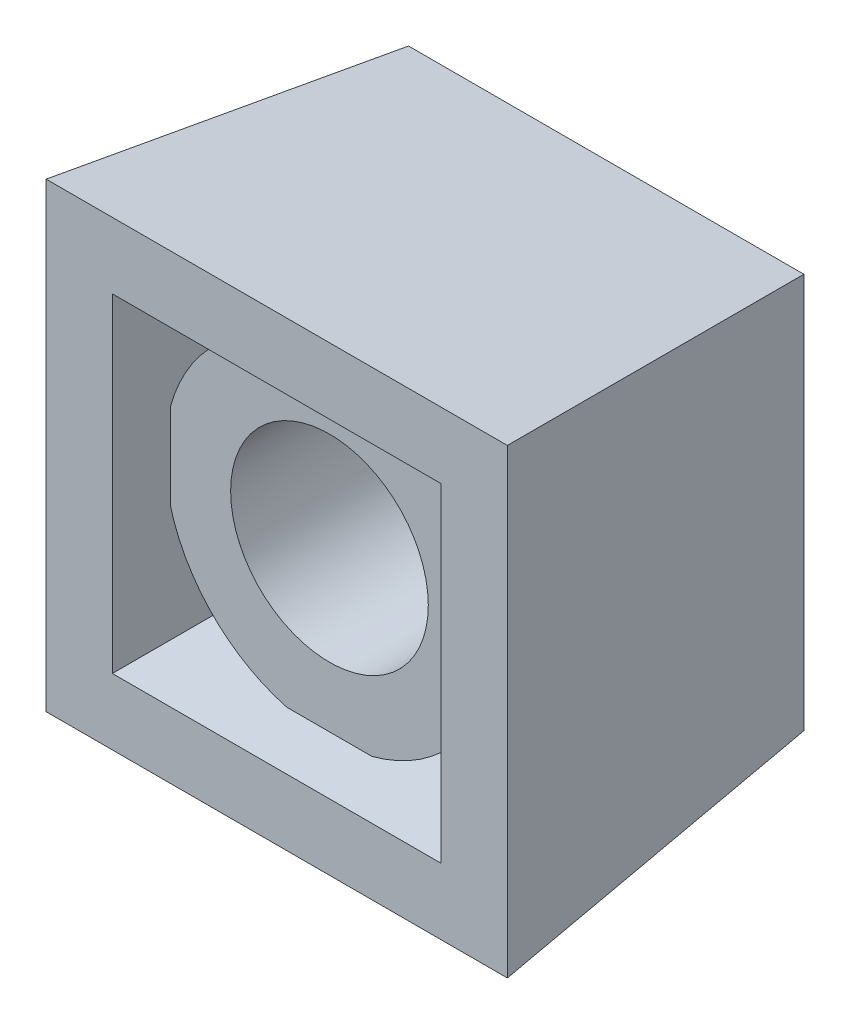
ISO-10303-21;
HEADER;
FILE_DESCRIPTION(('STEP AP214'),'2;1');
FILE_NAME('part.step','',(''),(''),'','','');
FILE_SCHEMA(('AUTOMOTIVE_DESIGN { 1 0 10303 214 1 1 1 1 }'));
ENDSEC;
DATA;
#1=APPLICATION_CONTEXT('core data for automotive mechanical design processes');
#2=APPLICATION_PROTOCOL_DEFINITION('international standard','automotive_design',2000,#1);
#3=PRODUCT_CONTEXT('',#1,'mechanical');
#4=PRODUCT('Part','Part','',(#3));
#5=PRODUCT_RELATED_PRODUCT_CATEGORY('part','',(#4));
#6=PRODUCT_DEFINITION_FORMATION('','',#4);
#7=PRODUCT_DEFINITION_CONTEXT('part definition',#1,'design');
#8=PRODUCT_DEFINITION('design','',#6,#7);
#9=PRODUCT_DEFINITION_SHAPE('','',#8);
#10=(LENGTH_UNIT() NAMED_UNIT(*) SI_UNIT(.MILLI.,.METRE.));
#11=(NAMED_UNIT(*) PLANE_ANGLE_UNIT() SI_UNIT($,.RADIAN.));
#12=(NAMED_UNIT(*) SI_UNIT($,.STERADIAN.) SOLID_ANGLE_UNIT());
#13=UNCERTAINTY_MEASURE_WITH_UNIT(LENGTH_MEASURE(1.E-05),#10,'distance_accuracy_value','');
#14=(GEOMETRIC_REPRESENTATION_CONTEXT(3) GLOBAL_UNCERTAINTY_ASSIGNED_CONTEXT((#13)) GLOBAL_UNIT_ASSIGNED_CONTEXT((#10,
#11,#12)) REPRESENTATION_CONTEXT('',''));
#15=CARTESIAN_POINT('',(0.,0.,0.));
#16=DIRECTION('',(0.,0.,1.));
#17=DIRECTION('',(1.,0.,0.));
#18=AXIS2_PLACEMENT_3D('',#15,#16,#17);
#19=CARTESIAN_POINT('',(0.,0.,1.));
#20=DIRECTION('',(0.,0.,1.));
#21=DIRECTION('',(1.,0.,0.));
#22=AXIS2_PLACEMENT_3D('',#19,#20,#21);
#23=PLANE('',#22);
#24=DIRECTION('',(0.,1.,0.));
#25=VECTOR('',#24,1.);
#26=CARTESIAN_POINT('',(2.09501243788791,0.,1.));
#27=LINE('',#26,#25);
#28=CARTESIAN_POINT('',(2.09501243788791,-2.09501243788791,1.));
#29=VERTEX_POINT('',#28);
#30=CARTESIAN_POINT('',(2.09501243788791,-1.36415647383097,1.));
#31=VERTEX_POINT('',#30);
#32=EDGE_CURVE('E164',#29,#31,#27,.T.);
#33=ORIENTED_EDGE('',*,*,#32,.T.);
#34=CARTESIAN_POINT('',(0.,0.,1.));
#35=DIRECTION('',(0.,0.,1.));
#36=DIRECTION('',(1.,0.,0.));
#37=AXIS2_PLACEMENT_3D('',#34,#35,#36);
#38=CIRCLE('',#37,2.5);
#39=CARTESIAN_POINT('',(1.36415647383097,-2.09501243788791,1.));
#40=VERTEX_POINT('',#39);
#41=EDGE_CURVE('E176',#40,#31,#38,.T.);
#42=ORIENTED_EDGE('',*,*,#41,.F.);
#43=DIRECTION('',(1.,0.,0.));
#44=VECTOR('',#43,1.);
#45=CARTESIAN_POINT('',(0.,-2.09501243788791,1.));
#46=LINE('',#45,#44);
#47=EDGE_CURVE('E230',#40,#29,#46,.T.);
#48=ORIENTED_EDGE('',*,*,#47,.T.);
#49=EDGE_LOOP('',(#33,#42,#48));
#50=FACE_BOUND('',#49,.T.);
#51=ADVANCED_FACE('F41',(#50),#23,.T.);
#52=CARTESIAN_POINT('',(-2.09501243788791,-2.09501243788791,1.));
#53=VERTEX_POINT('',#52);
#54=CARTESIAN_POINT('',(-1.36415647383097,-2.09501243788791,1.));
#55=VERTEX_POINT('',#54);
#56=EDGE_CURVE('E231',#53,#55,#46,.T.);
#57=ORIENTED_EDGE('',*,*,#56,.T.);
#58=CARTESIAN_POINT('',(-2.09501243788791,-1.36415647383097,1.));
#59=VERTEX_POINT('',#58);
#60=EDGE_CURVE('E524',#59,#55,#38,.T.);
#61=ORIENTED_EDGE('',*,*,#60,.F.);
#62=DIRECTION('',(0.,-1.,0.));
#63=VECTOR('',#62,1.);
#64=CARTESIAN_POINT('',(-2.09501243788791,0.,1.));
#65=LINE('',#64,#63);
#66=EDGE_CURVE('E234',#59,#53,#65,.T.);
#67=ORIENTED_EDGE('',*,*,#66,.T.);
#68=EDGE_LOOP('',(#57,#61,#67));
#69=FACE_BOUND('',#68,.T.);
#70=ADVANCED_FACE('F482',(#69),#23,.T.);
#71=CARTESIAN_POINT('',(-2.09501243788791,2.09501243788791,1.));
#72=VERTEX_POINT('',#71);
#73=CARTESIAN_POINT('',(-2.09501243788791,1.36415647383097,1.));
#74=VERTEX_POINT('',#73);
#75=EDGE_CURVE('E235',#72,#74,#65,.T.);
#76=ORIENTED_EDGE('',*,*,#75,.T.);
#77=CARTESIAN_POINT('',(-1.36415647383097,2.09501243788791,1.));
#78=VERTEX_POINT('',#77);
#79=EDGE_CURVE('E174',#78,#74,#38,.T.);
#80=ORIENTED_EDGE('',*,*,#79,.F.);
#81=DIRECTION('',(-1.,0.,0.));
#82=VECTOR('',#81,1.);
#83=CARTESIAN_POINT('',(0.,2.09501243788791,1.));
#84=LINE('',#83,#82);
#85=EDGE_CURVE('E237',#78,#72,#84,.T.);
#86=ORIENTED_EDGE('',*,*,#85,.T.);
#87=EDGE_LOOP('',(#76,#80,#86));
#88=FACE_BOUND('',#87,.T.);
#89=ADVANCED_FACE('F487',(#88),#23,.T.);
#90=CARTESIAN_POINT('',(0.,0.,5.));
#91=DIRECTION('',(0.,0.,-1.));
#92=DIRECTION('',(-1.,0.,0.));
#93=AXIS2_PLACEMENT_3D('',#90,#91,#92);
#94=PLANE('',#93);
#95=DIRECTION('',(0.,-1.,0.));
#96=VECTOR('',#95,1.);
#97=CARTESIAN_POINT('',(-3.5,3.5,5.));
#98=LINE('',#97,#96);
#99=CARTESIAN_POINT('',(-3.5,3.5,5.));
#100=VERTEX_POINT('',#99);
#101=CARTESIAN_POINT('',(-3.5,-3.5,5.));
#102=VERTEX_POINT('',#101);
#103=EDGE_CURVE('E239',#100,#102,#98,.T.);
#104=ORIENTED_EDGE('',*,*,#103,.T.);
#105=DIRECTION('',(1.,0.,0.));
#106=VECTOR('',#105,1.);
#107=CARTESIAN_POINT('',(3.5,-3.5,5.));
#108=LINE('',#107,#106);
#109=CARTESIAN_POINT('',(3.5,-3.5,5.));
#110=VERTEX_POINT('',#109);
#111=EDGE_CURVE('E373',#102,#110,#108,.T.);
#112=ORIENTED_EDGE('',*,*,#111,.T.);
#113=DIRECTION('',(0.,1.,0.));
#114=VECTOR('',#113,1.);
#115=CARTESIAN_POINT('',(3.5,3.5,5.));
#116=LINE('',#115,#114);
#117=CARTESIAN_POINT('',(3.5,3.5,5.));
#118=VERTEX_POINT('',#117);
#119=EDGE_CURVE('E387',#110,#118,#116,.T.);
#120=ORIENTED_EDGE('',*,*,#119,.T.);
#121=DIRECTION('',(-1.,0.,0.));
#122=VECTOR('',#121,1.);
#123=CARTESIAN_POINT('',(3.5,3.5,5.));
#124=LINE('',#123,#122);
#125=EDGE_CURVE('E263',#118,#100,#124,.T.);
#126=ORIENTED_EDGE('',*,*,#125,.T.);
#127=EDGE_LOOP('',(#104,#112,#120,#126));
#128=FACE_BOUND('',#127,.T.);
#129=DIRECTION('',(0.,-1.,0.));
#130=VECTOR('',#129,1.);
#131=CARTESIAN_POINT('',(-2.49501243788791,0.,5.));
#132=LINE('',#131,#130);
#133=CARTESIAN_POINT('',(-2.49501243788791,2.49501243788791,5.));
#134=VERTEX_POINT('',#133);
#135=CARTESIAN_POINT('',(-2.49501243788791,-2.49501243788791,5.));
#136=VERTEX_POINT('',#135);
#137=EDGE_CURVE('E228',#134,#136,#132,.T.);
#138=ORIENTED_EDGE('',*,*,#137,.F.);
#139=DIRECTION('',(-1.,0.,0.));
#140=VECTOR('',#139,1.);
#141=CARTESIAN_POINT('',(0.,2.49501243788791,5.));
#142=LINE('',#141,#140);
#143=CARTESIAN_POINT('',(2.49501243788791,2.49501243788791,5.));
#144=VERTEX_POINT('',#143);
#145=EDGE_CURVE('E244',#144,#134,#142,.T.);
#146=ORIENTED_EDGE('',*,*,#145,.F.);
#147=DIRECTION('',(0.,1.,0.));
#148=VECTOR('',#147,1.);
#149=CARTESIAN_POINT('',(2.49501243788791,0.,5.));
#150=LINE('',#149,#148);
#151=CARTESIAN_POINT('',(2.49501243788791,-2.49501243788791,5.));
#152=VERTEX_POINT('',#151);
#153=EDGE_CURVE('E255',#152,#144,#150,.T.);
#154=ORIENTED_EDGE('',*,*,#153,.F.);
#155=DIRECTION('',(1.,0.,0.));
#156=VECTOR('',#155,1.);
#157=CARTESIAN_POINT('',(0.,-2.49501243788791,5.));
#158=LINE('',#157,#156);
#159=EDGE_CURVE('E252',#136,#152,#158,.T.);
#160=ORIENTED_EDGE('',*,*,#159,.F.);
#161=EDGE_LOOP('',(#138,#146,#154,#160));
#162=FACE_BOUND('',#161,.T.);
#163=ADVANCED_FACE('F343',(#128,#162),#94,.F.);
#164=CARTESIAN_POINT('',(0.,0.,0.));
#165=DIRECTION('',(0.,0.,1.));
#166=DIRECTION('',(1.,0.,0.));
#167=AXIS2_PLACEMENT_3D('',#164,#165,#166);
#168=PLANE('',#167);
#169=DIRECTION('',(0.,1.,0.));
#170=VECTOR('',#169,1.);
#171=CARTESIAN_POINT('',(3.,3.,0.));
#172=LINE('',#171,#170);
#173=CARTESIAN_POINT('',(3.,-3.,0.));
#174=VERTEX_POINT('',#173);
#175=CARTESIAN_POINT('',(3.,3.,0.));
#176=VERTEX_POINT('',#175);
#177=EDGE_CURVE('E302',#174,#176,#172,.T.);
#178=ORIENTED_EDGE('',*,*,#177,.F.);
#179=DIRECTION('',(1.,0.,0.));
#180=VECTOR('',#179,1.);
#181=CARTESIAN_POINT('',(-3.,-3.,0.));
#182=LINE('',#181,#180);
#183=CARTESIAN_POINT('',(-3.,-3.,0.));
#184=VERTEX_POINT('',#183);
#185=EDGE_CURVE('E316',#184,#174,#182,.T.);
#186=ORIENTED_EDGE('',*,*,#185,.F.);
#187=DIRECTION('',(0.,-1.,0.));
#188=VECTOR('',#187,1.);
#189=CARTESIAN_POINT('',(-3.,3.,0.));
#190=LINE('',#189,#188);
#191=CARTESIAN_POINT('',(-3.,3.,0.));
#192=VERTEX_POINT('',#191);
#193=EDGE_CURVE('E185',#192,#184,#190,.T.);
#194=ORIENTED_EDGE('',*,*,#193,.F.);
#195=DIRECTION('',(-1.,0.,0.));
#196=VECTOR('',#195,1.);
#197=CARTESIAN_POINT('',(-3.,3.,0.));
#198=LINE('',#197,#196);
#199=EDGE_CURVE('E182',#176,#192,#198,.T.);
#200=ORIENTED_EDGE('',*,*,#199,.F.);
#201=EDGE_LOOP('',(#178,#186,#194,#200));
#202=FACE_BOUND('',#201,.T.);
#203=ADVANCED_FACE('F43',(#202),#168,.F.);
#204=CARTESIAN_POINT('',(-2.97029702970297,0.,-0.297029702970297));
#205=DIRECTION('',(-0.995037190209989,0.,-0.099503719020999));
#206=DIRECTION('',(-0.099503719020999,0.,0.995037190209989));
#207=AXIS2_PLACEMENT_3D('',#204,#205,#206);
#208=PLANE('',#207);
#209=DIRECTION('',(0.0990147542976675,-0.0990147542976676,-0.990147542976674));
#210=VECTOR('',#209,1.);
#211=CARTESIAN_POINT('',(-3.5,3.5,5.));
#212=LINE('',#211,#210);
#213=EDGE_CURVE('E362',#100,#192,#212,.T.);
#214=ORIENTED_EDGE('',*,*,#213,.T.);
#215=ORIENTED_EDGE('',*,*,#193,.T.);
#216=DIRECTION('',(0.0990147542976675,0.0990147542976673,-0.990147542976674));
#217=VECTOR('',#216,1.);
#218=CARTESIAN_POINT('',(-3.5,-3.5,5.));
#219=LINE('',#218,#217);
#220=EDGE_CURVE('E360',#102,#184,#219,.T.);
#221=ORIENTED_EDGE('',*,*,#220,.F.);
#222=ORIENTED_EDGE('',*,*,#103,.F.);
#223=EDGE_LOOP('',(#214,#215,#221,#222));
#224=FACE_BOUND('',#223,.T.);
#225=ADVANCED_FACE('F334',(#224),#208,.T.);
#226=CARTESIAN_POINT('',(0.,-2.97029702970297,-0.297029702970297));
#227=DIRECTION('',(0.,-0.995037190209989,-0.0995037190209987));
#228=DIRECTION('',(0.,0.0995037190209987,-0.995037190209989));
#229=AXIS2_PLACEMENT_3D('',#226,#227,#228);
#230=PLANE('',#229);
#231=ORIENTED_EDGE('',*,*,#220,.T.);
#232=ORIENTED_EDGE('',*,*,#185,.T.);
#233=DIRECTION('',(-0.0990147542976674,0.0990147542976671,-0.990147542976674));
#234=VECTOR('',#233,1.);
#235=CARTESIAN_POINT('',(3.5,-3.5,5.));
#236=LINE('',#235,#234);
#237=EDGE_CURVE('E376',#110,#174,#236,.T.);
#238=ORIENTED_EDGE('',*,*,#237,.F.);
#239=ORIENTED_EDGE('',*,*,#111,.F.);
#240=EDGE_LOOP('',(#231,#232,#238,#239));
#241=FACE_BOUND('',#240,.T.);
#242=ADVANCED_FACE('F281',(#241),#230,.T.);
#243=CARTESIAN_POINT('',(0.,2.97029702970297,-0.297029702970298));
#244=DIRECTION('',(0.,0.995037190209989,-0.0995037190209993));
#245=DIRECTION('',(0.,0.0995037190209993,0.995037190209989));
#246=AXIS2_PLACEMENT_3D('',#243,#244,#245);
#247=PLANE('',#246);
#248=DIRECTION('',(-0.0990147542976674,-0.0990147542976678,-0.990147542976674));
#249=VECTOR('',#248,1.);
#250=CARTESIAN_POINT('',(3.5,3.5,5.));
#251=LINE('',#250,#249);
#252=EDGE_CURVE('E269',#118,#176,#251,.T.);
#253=ORIENTED_EDGE('',*,*,#252,.T.);
#254=ORIENTED_EDGE('',*,*,#199,.T.);
#255=ORIENTED_EDGE('',*,*,#213,.F.);
#256=ORIENTED_EDGE('',*,*,#125,.F.);
#257=EDGE_LOOP('',(#253,#254,#255,#256));
#258=FACE_BOUND('',#257,.T.);
#259=ADVANCED_FACE('F271',(#258),#247,.T.);
#260=CARTESIAN_POINT('',(2.97029702970297,0.,-0.297029702970297));
#261=DIRECTION('',(0.995037190209989,0.,-0.0995037190209988));
#262=DIRECTION('',(-0.0995037190209988,0.,-0.995037190209989));
#263=AXIS2_PLACEMENT_3D('',#260,#261,#262);
#264=PLANE('',#263);
#265=ORIENTED_EDGE('',*,*,#237,.T.);
#266=ORIENTED_EDGE('',*,*,#177,.T.);
#267=ORIENTED_EDGE('',*,*,#252,.F.);
#268=ORIENTED_EDGE('',*,*,#119,.F.);
#269=EDGE_LOOP('',(#265,#266,#267,#268));
#270=FACE_BOUND('',#269,.T.);
#271=ADVANCED_FACE('F280',(#270),#264,.T.);
#272=CARTESIAN_POINT('',(2.09501243788791,2.09501243788791,1.));
#273=VERTEX_POINT('',#272);
#274=CARTESIAN_POINT('',(1.36415647383097,2.09501243788791,1.));
#275=VERTEX_POINT('',#274);
#276=EDGE_CURVE('E170',#273,#275,#84,.T.);
#277=ORIENTED_EDGE('',*,*,#276,.T.);
#278=CARTESIAN_POINT('',(2.09501243788791,1.36415647383097,1.));
#279=VERTEX_POINT('',#278);
#280=EDGE_CURVE('E168',#279,#275,#38,.T.);
#281=ORIENTED_EDGE('',*,*,#280,.F.);
#282=EDGE_CURVE('E153',#279,#273,#27,.T.);
#283=ORIENTED_EDGE('',*,*,#282,.T.);
#284=EDGE_LOOP('',(#277,#281,#283));
#285=FACE_BOUND('',#284,.T.);
#286=ADVANCED_FACE('F169',(#285),#23,.T.);
#287=CARTESIAN_POINT('',(-1.97525983949298,0.,-0.197525983949298));
#288=DIRECTION('',(-0.995037190209989,0.,-0.099503719020999));
#289=DIRECTION('',(-0.099503719020999,0.,0.995037190209989));
#290=AXIS2_PLACEMENT_3D('',#287,#288,#289);
#291=PLANE('',#290);
#292=CARTESIAN_POINT('',(0.,0.,-19.9501243788791));
#293=DIRECTION('',(-0.995037190209989,0.,-0.099503719020999));
#294=DIRECTION('',(0.099503719020999,0.,-0.995037190209989));
#295=AXIS2_PLACEMENT_3D('',#292,#293,#294);
#296=ELLIPSE('',#295,25.1246890528022,2.5);
#297=CARTESIAN_POINT('',(-2.41501243788791,0.646308691606949,4.2));
#298=VERTEX_POINT('',#297);
#299=EDGE_CURVE('E218',#74,#298,#296,.F.);
#300=ORIENTED_EDGE('',*,*,#299,.F.);
#301=ORIENTED_EDGE('',*,*,#75,.F.);
#302=DIRECTION('',(0.0990147542976675,-0.0990147542976678,-0.990147542976674));
#303=VECTOR('',#302,1.);
#304=CARTESIAN_POINT('',(-1.95589454694893,1.95589454694893,-0.391178909389787));
#305=LINE('',#304,#303);
#306=EDGE_CURVE('E240',#134,#72,#305,.T.);
#307=ORIENTED_EDGE('',*,*,#306,.F.);
#308=ORIENTED_EDGE('',*,*,#137,.T.);
#309=DIRECTION('',(0.0990147542976675,0.0990147542976673,-0.990147542976675));
#310=VECTOR('',#309,1.);
#311=CARTESIAN_POINT('',(-1.95589454694893,-1.95589454694893,-0.391178909389786));
#312=LINE('',#311,#310);
#313=EDGE_CURVE('E243',#136,#53,#312,.T.);
#314=ORIENTED_EDGE('',*,*,#313,.T.);
#315=ORIENTED_EDGE('',*,*,#66,.F.);
#316=CARTESIAN_POINT('',(-2.41501243788791,-0.64630869160695,4.2));
#317=VERTEX_POINT('',#316);
#318=EDGE_CURVE('E62',#317,#59,#296,.F.);
#319=ORIENTED_EDGE('',*,*,#318,.F.);
#320=DIRECTION('',(0.,1.,0.));
#321=VECTOR('',#320,1.);
#322=CARTESIAN_POINT('',(-2.41501243788791,0.,4.2));
#323=LINE('',#322,#321);
#324=EDGE_CURVE('E57',#317,#298,#323,.T.);
#325=ORIENTED_EDGE('',*,*,#324,.T.);
#326=EDGE_LOOP('',(#300,#301,#307,#308,#314,#315,#319,#325));
#327=FACE_BOUND('',#326,.T.);
#328=ADVANCED_FACE('F478',(#327),#291,.F.);
#329=CARTESIAN_POINT('',(0.,-1.97525983949298,-0.197525983949298));
#330=DIRECTION('',(0.,-0.995037190209989,-0.0995037190209987));
#331=DIRECTION('',(0.,0.0995037190209987,-0.995037190209989));
#332=AXIS2_PLACEMENT_3D('',#329,#330,#331);
#333=PLANE('',#332);
#334=CARTESIAN_POINT('',(0.,0.,-19.9501243788792));
#335=DIRECTION('',(0.,-0.995037190209989,-0.0995037190209987));
#336=DIRECTION('',(0.,0.0995037190209987,-0.995037190209989));
#337=AXIS2_PLACEMENT_3D('',#334,#335,#336);
#338=ELLIPSE('',#337,25.1246890528023,2.5);
#339=CARTESIAN_POINT('',(-0.646308691606951,-2.41501243788791,4.2));
#340=VERTEX_POINT('',#339);
#341=EDGE_CURVE('E223',#55,#340,#338,.F.);
#342=ORIENTED_EDGE('',*,*,#341,.F.);
#343=ORIENTED_EDGE('',*,*,#56,.F.);
#344=ORIENTED_EDGE('',*,*,#313,.F.);
#345=ORIENTED_EDGE('',*,*,#159,.T.);
#346=DIRECTION('',(-0.0990147542976674,0.0990147542976673,-0.990147542976675));
#347=VECTOR('',#346,1.);
#348=CARTESIAN_POINT('',(1.95589454694893,-1.95589454694893,-0.391178909389786));
#349=LINE('',#348,#347);
#350=EDGE_CURVE('E165',#152,#29,#349,.T.);
#351=ORIENTED_EDGE('',*,*,#350,.T.);
#352=ORIENTED_EDGE('',*,*,#47,.F.);
#353=CARTESIAN_POINT('',(0.646308691606949,-2.41501243788791,4.2));
#354=VERTEX_POINT('',#353);
#355=EDGE_CURVE('E225',#354,#40,#338,.F.);
#356=ORIENTED_EDGE('',*,*,#355,.F.);
#357=DIRECTION('',(-1.,0.,0.));
#358=VECTOR('',#357,1.);
#359=CARTESIAN_POINT('',(0.,-2.41501243788791,4.2));
#360=LINE('',#359,#358);
#361=EDGE_CURVE('E201',#354,#340,#360,.T.);
#362=ORIENTED_EDGE('',*,*,#361,.T.);
#363=EDGE_LOOP('',(#342,#343,#344,#345,#351,#352,#356,#362));
#364=FACE_BOUND('',#363,.T.);
#365=ADVANCED_FACE('F494',(#364),#333,.F.);
#366=CARTESIAN_POINT('',(0.,1.97525983949298,-0.197525983949299));
#367=DIRECTION('',(0.,0.995037190209989,-0.0995037190209993));
#368=DIRECTION('',(0.,0.0995037190209993,0.995037190209989));
#369=AXIS2_PLACEMENT_3D('',#366,#367,#368);
#370=PLANE('',#369);
#371=CARTESIAN_POINT('',(0.,0.,-19.950124378879));
#372=DIRECTION('',(0.,0.995037190209989,-0.0995037190209993));
#373=DIRECTION('',(0.,-0.0995037190209993,-0.995037190209989));
#374=AXIS2_PLACEMENT_3D('',#371,#372,#373);
#375=ELLIPSE('',#374,25.1246890528021,2.5);
#376=CARTESIAN_POINT('',(0.646308691606948,2.41501243788791,4.2));
#377=VERTEX_POINT('',#376);
#378=EDGE_CURVE('E209',#275,#377,#375,.F.);
#379=ORIENTED_EDGE('',*,*,#378,.F.);
#380=ORIENTED_EDGE('',*,*,#276,.F.);
#381=DIRECTION('',(-0.0990147542976673,-0.0990147542976678,-0.990147542976674));
#382=VECTOR('',#381,1.);
#383=CARTESIAN_POINT('',(1.95589454694893,1.95589454694893,-0.391178909389787));
#384=LINE('',#383,#382);
#385=EDGE_CURVE('E160',#144,#273,#384,.T.);
#386=ORIENTED_EDGE('',*,*,#385,.F.);
#387=ORIENTED_EDGE('',*,*,#145,.T.);
#388=ORIENTED_EDGE('',*,*,#306,.T.);
#389=ORIENTED_EDGE('',*,*,#85,.F.);
#390=CARTESIAN_POINT('',(-0.646308691606948,2.41501243788791,4.2));
#391=VERTEX_POINT('',#390);
#392=EDGE_CURVE('E206',#391,#78,#375,.F.);
#393=ORIENTED_EDGE('',*,*,#392,.F.);
#394=DIRECTION('',(1.,0.,0.));
#395=VECTOR('',#394,1.);
#396=CARTESIAN_POINT('',(0.,2.41501243788791,4.2));
#397=LINE('',#396,#395);
#398=EDGE_CURVE('E214',#391,#377,#397,.T.);
#399=ORIENTED_EDGE('',*,*,#398,.T.);
#400=EDGE_LOOP('',(#379,#380,#386,#387,#388,#389,#393,#399));
#401=FACE_BOUND('',#400,.T.);
#402=ADVANCED_FACE('F497',(#401),#370,.F.);
#403=CARTESIAN_POINT('',(1.97525983949298,0.,-0.197525983949298));
#404=DIRECTION('',(0.995037190209989,0.,-0.0995037190209988));
#405=DIRECTION('',(-0.0995037190209988,0.,-0.995037190209989));
#406=AXIS2_PLACEMENT_3D('',#403,#404,#405);
#407=PLANE('',#406);
#408=CARTESIAN_POINT('',(0.,0.,-19.9501243788791));
#409=DIRECTION('',(0.995037190209989,0.,-0.0995037190209988));
#410=DIRECTION('',(-0.0995037190209988,0.,-0.995037190209989));
#411=AXIS2_PLACEMENT_3D('',#408,#409,#410);
#412=ELLIPSE('',#411,25.1246890528022,2.5);
#413=CARTESIAN_POINT('',(2.41501243788791,-0.646308691606949,4.2));
#414=VERTEX_POINT('',#413);
#415=EDGE_CURVE('E50',#31,#414,#412,.F.);
#416=ORIENTED_EDGE('',*,*,#415,.F.);
#417=ORIENTED_EDGE('',*,*,#32,.F.);
#418=ORIENTED_EDGE('',*,*,#350,.F.);
#419=ORIENTED_EDGE('',*,*,#153,.T.);
#420=ORIENTED_EDGE('',*,*,#385,.T.);
#421=ORIENTED_EDGE('',*,*,#282,.F.);
#422=CARTESIAN_POINT('',(2.41501243788791,0.646308691606948,4.2));
#423=VERTEX_POINT('',#422);
#424=EDGE_CURVE('E157',#423,#279,#412,.F.);
#425=ORIENTED_EDGE('',*,*,#424,.F.);
#426=DIRECTION('',(0.,-1.,0.));
#427=VECTOR('',#426,1.);
#428=CARTESIAN_POINT('',(2.41501243788791,0.,4.2));
#429=LINE('',#428,#427);
#430=EDGE_CURVE('E181',#423,#414,#429,.T.);
#431=ORIENTED_EDGE('',*,*,#430,.T.);
#432=EDGE_LOOP('',(#416,#417,#418,#419,#420,#421,#425,#431));
#433=FACE_BOUND('',#432,.T.);
#434=ADVANCED_FACE('F155',(#433),#407,.F.);
#435=CARTESIAN_POINT('',(0.,0.,4.2));
#436=DIRECTION('',(0.,0.,1.));
#437=DIRECTION('',(1.,0.,0.));
#438=AXIS2_PLACEMENT_3D('',#435,#436,#437);
#439=PLANE('',#438);
#440=CARTESIAN_POINT('',(0.,0.,4.2));
#441=DIRECTION('',(0.,0.,1.));
#442=DIRECTION('',(1.,0.,0.));
#443=AXIS2_PLACEMENT_3D('',#440,#441,#442);
#444=CIRCLE('',#443,1.5);
#445=CARTESIAN_POINT('',(1.5,0.,4.2));
#446=VERTEX_POINT('',#445);
#447=EDGE_CURVE('E522',#446,#446,#444,.T.);
#448=ORIENTED_EDGE('',*,*,#447,.F.);
#449=EDGE_LOOP('',(#448));
#450=FACE_BOUND('',#449,.T.);
#451=ORIENTED_EDGE('',*,*,#324,.F.);
#452=CARTESIAN_POINT('',(0.,0.,4.2));
#453=DIRECTION('',(0.,0.,1.));
#454=DIRECTION('',(1.,0.,0.));
#455=AXIS2_PLACEMENT_3D('',#452,#453,#454);
#456=CIRCLE('',#455,2.5);
#457=EDGE_CURVE('E202',#317,#340,#456,.T.);
#458=ORIENTED_EDGE('',*,*,#457,.T.);
#459=ORIENTED_EDGE('',*,*,#361,.F.);
#460=EDGE_CURVE('E173',#354,#414,#456,.T.);
#461=ORIENTED_EDGE('',*,*,#460,.T.);
#462=ORIENTED_EDGE('',*,*,#430,.F.);
#463=EDGE_CURVE('E180',#423,#377,#456,.T.);
#464=ORIENTED_EDGE('',*,*,#463,.T.);
#465=ORIENTED_EDGE('',*,*,#398,.F.);
#466=EDGE_CURVE('E204',#391,#298,#456,.T.);
#467=ORIENTED_EDGE('',*,*,#466,.T.);
#468=EDGE_LOOP('',(#451,#458,#459,#461,#462,#464,#465,#467));
#469=FACE_BOUND('',#468,.T.);
#470=ADVANCED_FACE('F199',(#450,#469),#439,.T.);
#471=CARTESIAN_POINT('',(0.,0.,4.2));
#472=DIRECTION('',(0.,0.,-1.));
#473=DIRECTION('',(-1.,0.,0.));
#474=AXIS2_PLACEMENT_3D('',#471,#472,#473);
#475=CYLINDRICAL_SURFACE('',#474,2.5);
#476=ORIENTED_EDGE('',*,*,#79,.T.);
#477=ORIENTED_EDGE('',*,*,#299,.T.);
#478=ORIENTED_EDGE('',*,*,#466,.F.);
#479=ORIENTED_EDGE('',*,*,#392,.T.);
#480=EDGE_LOOP('',(#476,#477,#478,#479));
#481=FACE_BOUND('',#480,.T.);
#482=ADVANCED_FACE('F217',(#481),#475,.T.);
#483=ORIENTED_EDGE('',*,*,#457,.F.);
#484=ORIENTED_EDGE('',*,*,#318,.T.);
#485=ORIENTED_EDGE('',*,*,#60,.T.);
#486=ORIENTED_EDGE('',*,*,#341,.T.);
#487=EDGE_LOOP('',(#483,#484,#485,#486));
#488=FACE_BOUND('',#487,.T.);
#489=ADVANCED_FACE('F509',(#488),#475,.T.);
#490=ORIENTED_EDGE('',*,*,#460,.F.);
#491=ORIENTED_EDGE('',*,*,#355,.T.);
#492=ORIENTED_EDGE('',*,*,#41,.T.);
#493=ORIENTED_EDGE('',*,*,#415,.T.);
#494=EDGE_LOOP('',(#490,#491,#492,#493));
#495=FACE_BOUND('',#494,.T.);
#496=ADVANCED_FACE('F193',(#495),#475,.T.);
#497=ORIENTED_EDGE('',*,*,#280,.T.);
#498=ORIENTED_EDGE('',*,*,#378,.T.);
#499=ORIENTED_EDGE('',*,*,#463,.F.);
#500=ORIENTED_EDGE('',*,*,#424,.T.);
#501=EDGE_LOOP('',(#497,#498,#499,#500));
#502=FACE_BOUND('',#501,.T.);
#503=ADVANCED_FACE('F178',(#502),#475,.T.);
#504=CARTESIAN_POINT('',(0.,0.,4.2));
#505=DIRECTION('',(0.,0.,-1.));
#506=DIRECTION('',(-1.,0.,0.));
#507=AXIS2_PLACEMENT_3D('',#504,#505,#506);
#508=CYLINDRICAL_SURFACE('',#507,1.5);
#509=ORIENTED_EDGE('',*,*,#447,.T.);
#510=EDGE_LOOP('',(#509));
#511=FACE_BOUND('',#510,.T.);
#512=CARTESIAN_POINT('',(0.,0.,1.));
#513=DIRECTION('',(0.,0.,1.));
#514=DIRECTION('',(1.,0.,0.));
#515=AXIS2_PLACEMENT_3D('',#512,#513,#514);
#516=CIRCLE('',#515,1.5);
#517=CARTESIAN_POINT('',(1.5,0.,1.));
#518=VERTEX_POINT('',#517);
#519=EDGE_CURVE('E12',#518,#518,#516,.F.);
#520=ORIENTED_EDGE('',*,*,#519,.T.);
#521=EDGE_LOOP('',(#520));
#522=FACE_BOUND('',#521,.T.);
#523=ADVANCED_FACE('F512',(#511,#522),#508,.F.);
#524=ORIENTED_EDGE('',*,*,#519,.F.);
#525=EDGE_LOOP('',(#524));
#526=FACE_BOUND('',#525,.T.);
#527=ADVANCED_FACE('F480',(#526),#23,.T.);
#528=CLOSED_SHELL('',(#51,#70,#89,#163,#203,#225,#242,#259,#271,#286,#328,#365,#402,#434,#470,
#482,#489,#496,#503,#523,#527));
#529=MANIFOLD_SOLID_BREP('B2',#528);
#530=ADVANCED_BREP_SHAPE_REPRESENTATION('',(#18,#529),#14);
#531=SHAPE_DEFINITION_REPRESENTATION(#9,#530);
ENDSEC;
END-ISO-10303-21;
